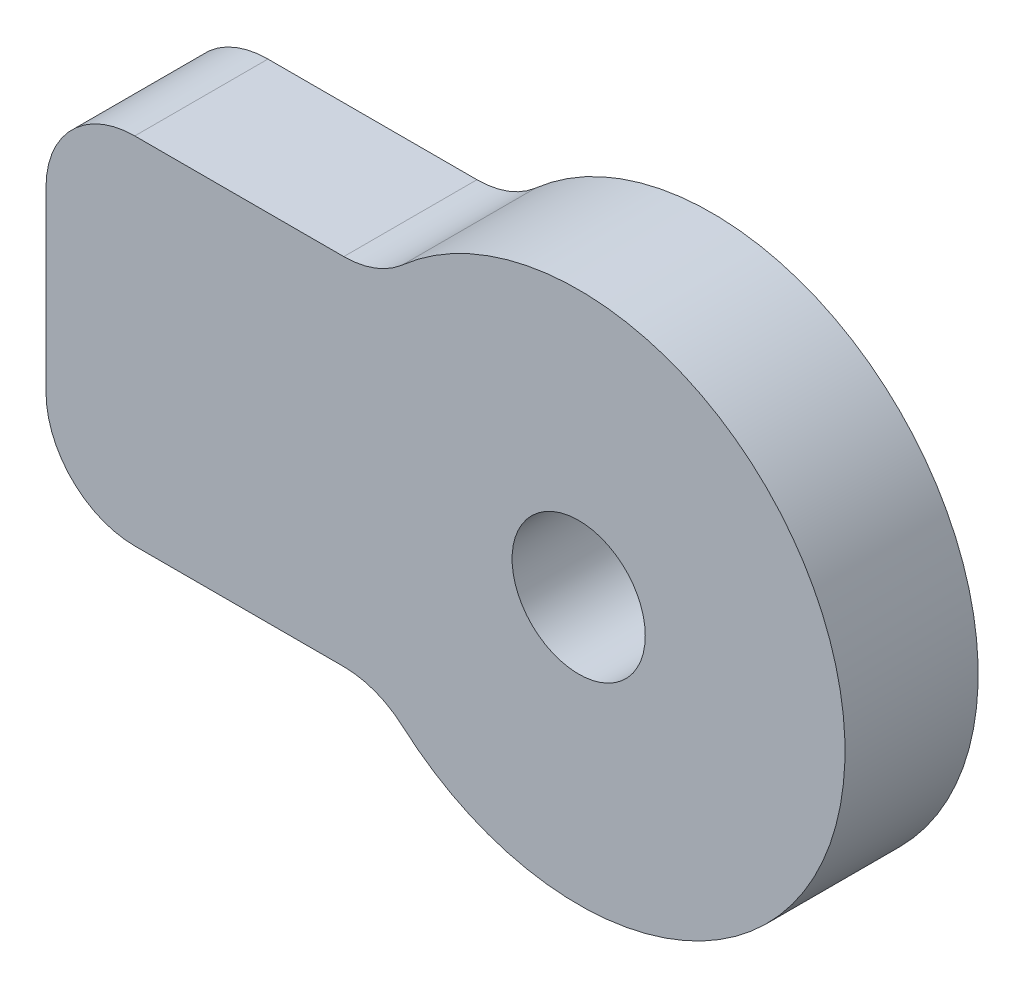
ISO-10303-21;
HEADER;
FILE_DESCRIPTION(('STEP AP214'),'2;1');
FILE_NAME('part.step','',(''),(''),'','','');
FILE_SCHEMA(('AUTOMOTIVE_DESIGN { 1 0 10303 214 1 1 1 1 }'));
ENDSEC;
DATA;
#1=APPLICATION_CONTEXT('core data for automotive mechanical design processes');
#2=APPLICATION_PROTOCOL_DEFINITION('international standard','automotive_design',2000,#1);
#3=PRODUCT_CONTEXT('',#1,'mechanical');
#4=PRODUCT('Part','Part','',(#3));
#5=PRODUCT_RELATED_PRODUCT_CATEGORY('part','',(#4));
#6=PRODUCT_DEFINITION_FORMATION('','',#4);
#7=PRODUCT_DEFINITION_CONTEXT('part definition',#1,'design');
#8=PRODUCT_DEFINITION('design','',#6,#7);
#9=PRODUCT_DEFINITION_SHAPE('','',#8);
#10=(LENGTH_UNIT() NAMED_UNIT(*) SI_UNIT(.MILLI.,.METRE.));
#11=(NAMED_UNIT(*) PLANE_ANGLE_UNIT() SI_UNIT($,.RADIAN.));
#12=(NAMED_UNIT(*) SI_UNIT($,.STERADIAN.) SOLID_ANGLE_UNIT());
#13=UNCERTAINTY_MEASURE_WITH_UNIT(LENGTH_MEASURE(1.E-05),#10,'distance_accuracy_value','');
#14=(GEOMETRIC_REPRESENTATION_CONTEXT(3) GLOBAL_UNCERTAINTY_ASSIGNED_CONTEXT((#13)) GLOBAL_UNIT_ASSIGNED_CONTEXT((#10,
#11,#12)) REPRESENTATION_CONTEXT('',''));
#15=CARTESIAN_POINT('',(0.,0.,0.));
#16=DIRECTION('',(0.,0.,1.));
#17=DIRECTION('',(1.,0.,0.));
#18=AXIS2_PLACEMENT_3D('',#15,#16,#17);
#19=CARTESIAN_POINT('',(0.,0.,3.));
#20=DIRECTION('',(0.,0.,1.));
#21=DIRECTION('',(1.,0.,0.));
#22=AXIS2_PLACEMENT_3D('',#19,#20,#21);
#23=PLANE('',#22);
#24=DIRECTION('',(0.,-1.,0.));
#25=VECTOR('',#24,1.);
#26=CARTESIAN_POINT('',(-12.,4.,3.));
#27=LINE('',#26,#25);
#28=CARTESIAN_POINT('',(-12.,2.,3.));
#29=VERTEX_POINT('',#28);
#30=CARTESIAN_POINT('',(-12.,-2.,3.));
#31=VERTEX_POINT('',#30);
#32=EDGE_CURVE('E166',#29,#31,#27,.T.);
#33=ORIENTED_EDGE('',*,*,#32,.T.);
#34=CARTESIAN_POINT('',(-10.,-2.,3.));
#35=DIRECTION('',(0.,0.,1.));
#36=DIRECTION('',(1.,0.,0.));
#37=AXIS2_PLACEMENT_3D('',#34,#35,#36);
#38=CIRCLE('',#37,2.);
#39=CARTESIAN_POINT('',(-9.99999999999934,-4.,3.));
#40=VERTEX_POINT('',#39);
#41=EDGE_CURVE('E153',#31,#40,#38,.T.);
#42=ORIENTED_EDGE('',*,*,#41,.T.);
#43=DIRECTION('',(1.,0.,0.));
#44=VECTOR('',#43,1.);
#45=CARTESIAN_POINT('',(-4.47213595499907,-4.,3.));
#46=LINE('',#45,#44);
#47=CARTESIAN_POINT('',(-5.29150262212852,-4.,3.));
#48=VERTEX_POINT('',#47);
#49=EDGE_CURVE('E131',#40,#48,#46,.T.);
#50=ORIENTED_EDGE('',*,*,#49,.T.);
#51=CARTESIAN_POINT('',(-5.29150262212852,-6.,3.));
#52=DIRECTION('',(0.,0.,1.));
#53=DIRECTION('',(1.,0.,0.));
#54=AXIS2_PLACEMENT_3D('',#51,#52,#53);
#55=CIRCLE('',#54,2.);
#56=CARTESIAN_POINT('',(-3.96862696659639,-4.5,3.));
#57=VERTEX_POINT('',#56);
#58=EDGE_CURVE('E107',#48,#57,#55,.F.);
#59=ORIENTED_EDGE('',*,*,#58,.T.);
#60=CARTESIAN_POINT('',(0.,0.,3.));
#61=DIRECTION('',(0.,0.,1.));
#62=DIRECTION('',(1.,0.,0.));
#63=AXIS2_PLACEMENT_3D('',#60,#61,#62);
#64=CIRCLE('',#63,6.);
#65=CARTESIAN_POINT('',(-3.96862696659683,4.5,3.));
#66=VERTEX_POINT('',#65);
#67=EDGE_CURVE('E115',#57,#66,#64,.T.);
#68=ORIENTED_EDGE('',*,*,#67,.T.);
#69=CARTESIAN_POINT('',(-5.29150262212918,6.,3.));
#70=DIRECTION('',(0.,0.,1.));
#71=DIRECTION('',(1.,0.,0.));
#72=AXIS2_PLACEMENT_3D('',#69,#70,#71);
#73=CIRCLE('',#72,2.);
#74=CARTESIAN_POINT('',(-5.29150262212918,4.,3.));
#75=VERTEX_POINT('',#74);
#76=EDGE_CURVE('E11',#66,#75,#73,.F.);
#77=ORIENTED_EDGE('',*,*,#76,.T.);
#78=DIRECTION('',(-1.,0.,0.));
#79=VECTOR('',#78,1.);
#80=CARTESIAN_POINT('',(-4.47213595499951,4.,3.));
#81=LINE('',#80,#79);
#82=CARTESIAN_POINT('',(-10.,4.,3.));
#83=VERTEX_POINT('',#82);
#84=EDGE_CURVE('E167',#75,#83,#81,.T.);
#85=ORIENTED_EDGE('',*,*,#84,.T.);
#86=CARTESIAN_POINT('',(-10.,2.,3.));
#87=DIRECTION('',(0.,0.,1.));
#88=DIRECTION('',(1.,0.,0.));
#89=AXIS2_PLACEMENT_3D('',#86,#87,#88);
#90=CIRCLE('',#89,2.);
#91=EDGE_CURVE('E151',#83,#29,#90,.T.);
#92=ORIENTED_EDGE('',*,*,#91,.T.);
#93=EDGE_LOOP('',(#33,#42,#50,#59,#68,#77,#85,#92));
#94=FACE_BOUND('',#93,.T.);
#95=CARTESIAN_POINT('',(0.,0.,3.));
#96=DIRECTION('',(0.,0.,1.));
#97=DIRECTION('',(1.,0.,0.));
#98=AXIS2_PLACEMENT_3D('',#95,#96,#97);
#99=CIRCLE('',#98,1.5);
#100=CARTESIAN_POINT('',(1.5,0.,3.));
#101=VERTEX_POINT('',#100);
#102=EDGE_CURVE('E123',#101,#101,#99,.T.);
#103=ORIENTED_EDGE('',*,*,#102,.F.);
#104=EDGE_LOOP('',(#103));
#105=FACE_BOUND('',#104,.T.);
#106=ADVANCED_FACE('F32',(#94,#105),#23,.T.);
#107=CARTESIAN_POINT('',(0.,0.,0.));
#108=DIRECTION('',(0.,0.,1.));
#109=DIRECTION('',(1.,0.,0.));
#110=AXIS2_PLACEMENT_3D('',#107,#108,#109);
#111=PLANE('',#110);
#112=DIRECTION('',(1.,0.,0.));
#113=VECTOR('',#112,1.);
#114=CARTESIAN_POINT('',(-4.47213595499907,-4.,0.));
#115=LINE('',#114,#113);
#116=CARTESIAN_POINT('',(-9.99999999999934,-4.,0.));
#117=VERTEX_POINT('',#116);
#118=CARTESIAN_POINT('',(-5.29150262212852,-4.,0.));
#119=VERTEX_POINT('',#118);
#120=EDGE_CURVE('E136',#117,#119,#115,.T.);
#121=ORIENTED_EDGE('',*,*,#120,.F.);
#122=CARTESIAN_POINT('',(-10.,-2.,0.));
#123=DIRECTION('',(0.,0.,1.));
#124=DIRECTION('',(1.,0.,0.));
#125=AXIS2_PLACEMENT_3D('',#122,#123,#124);
#126=CIRCLE('',#125,2.);
#127=CARTESIAN_POINT('',(-12.,-2.,0.));
#128=VERTEX_POINT('',#127);
#129=EDGE_CURVE('E144',#117,#128,#126,.F.);
#130=ORIENTED_EDGE('',*,*,#129,.T.);
#131=DIRECTION('',(0.,-1.,0.));
#132=VECTOR('',#131,1.);
#133=CARTESIAN_POINT('',(-12.,4.,0.));
#134=LINE('',#133,#132);
#135=CARTESIAN_POINT('',(-12.,2.,0.));
#136=VERTEX_POINT('',#135);
#137=EDGE_CURVE('E125',#136,#128,#134,.T.);
#138=ORIENTED_EDGE('',*,*,#137,.F.);
#139=CARTESIAN_POINT('',(-10.,2.,0.));
#140=DIRECTION('',(0.,0.,1.));
#141=DIRECTION('',(1.,0.,0.));
#142=AXIS2_PLACEMENT_3D('',#139,#140,#141);
#143=CIRCLE('',#142,2.);
#144=CARTESIAN_POINT('',(-10.,4.,0.));
#145=VERTEX_POINT('',#144);
#146=EDGE_CURVE('E142',#136,#145,#143,.F.);
#147=ORIENTED_EDGE('',*,*,#146,.T.);
#148=DIRECTION('',(-1.,0.,0.));
#149=VECTOR('',#148,1.);
#150=CARTESIAN_POINT('',(-4.47213595499951,4.,0.));
#151=LINE('',#150,#149);
#152=CARTESIAN_POINT('',(-5.29150262212918,4.,0.));
#153=VERTEX_POINT('',#152);
#154=EDGE_CURVE('E122',#153,#145,#151,.T.);
#155=ORIENTED_EDGE('',*,*,#154,.F.);
#156=CARTESIAN_POINT('',(-5.29150262212918,6.,0.));
#157=DIRECTION('',(0.,0.,1.));
#158=DIRECTION('',(1.,0.,0.));
#159=AXIS2_PLACEMENT_3D('',#156,#157,#158);
#160=CIRCLE('',#159,2.);
#161=CARTESIAN_POINT('',(-3.96862696659683,4.5,0.));
#162=VERTEX_POINT('',#161);
#163=EDGE_CURVE('E40',#153,#162,#160,.T.);
#164=ORIENTED_EDGE('',*,*,#163,.T.);
#165=CARTESIAN_POINT('',(0.,0.,0.));
#166=DIRECTION('',(0.,0.,1.));
#167=DIRECTION('',(1.,0.,0.));
#168=AXIS2_PLACEMENT_3D('',#165,#166,#167);
#169=CIRCLE('',#168,6.);
#170=CARTESIAN_POINT('',(-3.96862696659639,-4.5,0.));
#171=VERTEX_POINT('',#170);
#172=EDGE_CURVE('E113',#171,#162,#169,.T.);
#173=ORIENTED_EDGE('',*,*,#172,.F.);
#174=CARTESIAN_POINT('',(-5.29150262212852,-6.,0.));
#175=DIRECTION('',(0.,0.,1.));
#176=DIRECTION('',(1.,0.,0.));
#177=AXIS2_PLACEMENT_3D('',#174,#175,#176);
#178=CIRCLE('',#177,2.);
#179=EDGE_CURVE('E97',#171,#119,#178,.T.);
#180=ORIENTED_EDGE('',*,*,#179,.T.);
#181=EDGE_LOOP('',(#121,#130,#138,#147,#155,#164,#173,#180));
#182=FACE_BOUND('',#181,.T.);
#183=CARTESIAN_POINT('',(0.,0.,0.));
#184=DIRECTION('',(0.,0.,1.));
#185=DIRECTION('',(1.,0.,0.));
#186=AXIS2_PLACEMENT_3D('',#183,#184,#185);
#187=CIRCLE('',#186,1.5);
#188=CARTESIAN_POINT('',(1.5,0.,0.));
#189=VERTEX_POINT('',#188);
#190=EDGE_CURVE('E128',#189,#189,#187,.T.);
#191=ORIENTED_EDGE('',*,*,#190,.T.);
#192=EDGE_LOOP('',(#191));
#193=FACE_BOUND('',#192,.T.);
#194=ADVANCED_FACE('F119',(#182,#193),#111,.F.);
#195=CARTESIAN_POINT('',(0.,0.,3.));
#196=DIRECTION('',(0.,0.,-1.));
#197=DIRECTION('',(-1.,0.,0.));
#198=AXIS2_PLACEMENT_3D('',#195,#196,#197);
#199=CYLINDRICAL_SURFACE('',#198,6.);
#200=ORIENTED_EDGE('',*,*,#67,.F.);
#201=DIRECTION('',(0.,0.,-1.));
#202=VECTOR('',#201,1.);
#203=CARTESIAN_POINT('',(-3.96862696659639,-4.5,3.));
#204=LINE('',#203,#202);
#205=EDGE_CURVE('E101',#57,#171,#204,.T.);
#206=ORIENTED_EDGE('',*,*,#205,.T.);
#207=ORIENTED_EDGE('',*,*,#172,.T.);
#208=DIRECTION('',(0.,0.,-1.));
#209=VECTOR('',#208,1.);
#210=CARTESIAN_POINT('',(-3.96862696659683,4.5,3.));
#211=LINE('',#210,#209);
#212=EDGE_CURVE('E117',#162,#66,#211,.F.);
#213=ORIENTED_EDGE('',*,*,#212,.T.);
#214=EDGE_LOOP('',(#200,#206,#207,#213));
#215=FACE_BOUND('',#214,.T.);
#216=ADVANCED_FACE('F112',(#215),#199,.T.);
#217=CARTESIAN_POINT('',(-4.47213595499951,4.,3.));
#218=DIRECTION('',(0.,-1.,0.));
#219=DIRECTION('',(1.,0.,0.));
#220=AXIS2_PLACEMENT_3D('',#217,#218,#219);
#221=PLANE('',#220);
#222=ORIENTED_EDGE('',*,*,#154,.T.);
#223=DIRECTION('',(0.,0.,-1.));
#224=VECTOR('',#223,1.);
#225=CARTESIAN_POINT('',(-10.,4.,3.));
#226=LINE('',#225,#224);
#227=EDGE_CURVE('E47',#145,#83,#226,.F.);
#228=ORIENTED_EDGE('',*,*,#227,.T.);
#229=ORIENTED_EDGE('',*,*,#84,.F.);
#230=DIRECTION('',(0.,0.,1.));
#231=VECTOR('',#230,1.);
#232=CARTESIAN_POINT('',(-5.29150262212918,4.,0.));
#233=LINE('',#232,#231);
#234=EDGE_CURVE('E155',#75,#153,#233,.F.);
#235=ORIENTED_EDGE('',*,*,#234,.T.);
#236=EDGE_LOOP('',(#222,#228,#229,#235));
#237=FACE_BOUND('',#236,.T.);
#238=ADVANCED_FACE('F197',(#237),#221,.F.);
#239=CARTESIAN_POINT('',(-12.,4.,3.));
#240=DIRECTION('',(1.,0.,0.));
#241=DIRECTION('',(0.,0.,-1.));
#242=AXIS2_PLACEMENT_3D('',#239,#240,#241);
#243=PLANE('',#242);
#244=ORIENTED_EDGE('',*,*,#137,.T.);
#245=DIRECTION('',(0.,0.,-1.));
#246=VECTOR('',#245,1.);
#247=CARTESIAN_POINT('',(-12.,-2.,3.));
#248=LINE('',#247,#246);
#249=EDGE_CURVE('E149',#128,#31,#248,.F.);
#250=ORIENTED_EDGE('',*,*,#249,.T.);
#251=ORIENTED_EDGE('',*,*,#32,.F.);
#252=DIRECTION('',(0.,0.,-1.));
#253=VECTOR('',#252,1.);
#254=CARTESIAN_POINT('',(-12.,2.,3.));
#255=LINE('',#254,#253);
#256=EDGE_CURVE('E146',#29,#136,#255,.T.);
#257=ORIENTED_EDGE('',*,*,#256,.T.);
#258=EDGE_LOOP('',(#244,#250,#251,#257));
#259=FACE_BOUND('',#258,.T.);
#260=ADVANCED_FACE('F186',(#259),#243,.F.);
#261=CARTESIAN_POINT('',(-4.47213595499907,-4.,3.));
#262=DIRECTION('',(0.,1.,0.));
#263=DIRECTION('',(-1.,0.,0.));
#264=AXIS2_PLACEMENT_3D('',#261,#262,#263);
#265=PLANE('',#264);
#266=ORIENTED_EDGE('',*,*,#120,.T.);
#267=DIRECTION('',(0.,0.,1.));
#268=VECTOR('',#267,1.);
#269=CARTESIAN_POINT('',(-5.29150262212852,-4.,3.));
#270=LINE('',#269,#268);
#271=EDGE_CURVE('E102',#119,#48,#270,.T.);
#272=ORIENTED_EDGE('',*,*,#271,.T.);
#273=ORIENTED_EDGE('',*,*,#49,.F.);
#274=DIRECTION('',(0.,0.,-1.));
#275=VECTOR('',#274,1.);
#276=CARTESIAN_POINT('',(-9.99999999999934,-4.,3.));
#277=LINE('',#276,#275);
#278=EDGE_CURVE('E116',#40,#117,#277,.T.);
#279=ORIENTED_EDGE('',*,*,#278,.T.);
#280=EDGE_LOOP('',(#266,#272,#273,#279));
#281=FACE_BOUND('',#280,.T.);
#282=ADVANCED_FACE('F177',(#281),#265,.F.);
#283=CARTESIAN_POINT('',(0.,0.,3.));
#284=DIRECTION('',(0.,0.,-1.));
#285=DIRECTION('',(-1.,0.,0.));
#286=AXIS2_PLACEMENT_3D('',#283,#284,#285);
#287=CYLINDRICAL_SURFACE('',#286,1.5);
#288=ORIENTED_EDGE('',*,*,#102,.T.);
#289=EDGE_LOOP('',(#288));
#290=FACE_BOUND('',#289,.T.);
#291=ORIENTED_EDGE('',*,*,#190,.F.);
#292=EDGE_LOOP('',(#291));
#293=FACE_BOUND('',#292,.T.);
#294=ADVANCED_FACE('F175',(#290,#293),#287,.F.);
#295=CARTESIAN_POINT('',(-5.29150262212852,-6.,3.));
#296=DIRECTION('',(0.,0.,-1.));
#297=DIRECTION('',(-1.,0.,0.));
#298=AXIS2_PLACEMENT_3D('',#295,#296,#297);
#299=CYLINDRICAL_SURFACE('',#298,2.);
#300=ORIENTED_EDGE('',*,*,#58,.F.);
#301=ORIENTED_EDGE('',*,*,#271,.F.);
#302=ORIENTED_EDGE('',*,*,#179,.F.);
#303=ORIENTED_EDGE('',*,*,#205,.F.);
#304=EDGE_LOOP('',(#300,#301,#302,#303));
#305=FACE_BOUND('',#304,.T.);
#306=ADVANCED_FACE('F100',(#305),#299,.F.);
#307=CARTESIAN_POINT('',(-10.,-2.,3.));
#308=DIRECTION('',(0.,0.,-1.));
#309=DIRECTION('',(-1.,0.,0.));
#310=AXIS2_PLACEMENT_3D('',#307,#308,#309);
#311=CYLINDRICAL_SURFACE('',#310,2.);
#312=ORIENTED_EDGE('',*,*,#41,.F.);
#313=ORIENTED_EDGE('',*,*,#249,.F.);
#314=ORIENTED_EDGE('',*,*,#129,.F.);
#315=ORIENTED_EDGE('',*,*,#278,.F.);
#316=EDGE_LOOP('',(#312,#313,#314,#315));
#317=FACE_BOUND('',#316,.T.);
#318=ADVANCED_FACE('F184',(#317),#311,.T.);
#319=CARTESIAN_POINT('',(-10.,2.,3.));
#320=DIRECTION('',(0.,0.,-1.));
#321=DIRECTION('',(-1.,0.,0.));
#322=AXIS2_PLACEMENT_3D('',#319,#320,#321);
#323=CYLINDRICAL_SURFACE('',#322,2.);
#324=ORIENTED_EDGE('',*,*,#91,.F.);
#325=ORIENTED_EDGE('',*,*,#227,.F.);
#326=ORIENTED_EDGE('',*,*,#146,.F.);
#327=ORIENTED_EDGE('',*,*,#256,.F.);
#328=EDGE_LOOP('',(#324,#325,#326,#327));
#329=FACE_BOUND('',#328,.T.);
#330=ADVANCED_FACE('F204',(#329),#323,.T.);
#331=CARTESIAN_POINT('',(-5.29150262212918,6.,3.));
#332=DIRECTION('',(0.,0.,-1.));
#333=DIRECTION('',(-1.,0.,0.));
#334=AXIS2_PLACEMENT_3D('',#331,#332,#333);
#335=CYLINDRICAL_SURFACE('',#334,2.);
#336=ORIENTED_EDGE('',*,*,#76,.F.);
#337=ORIENTED_EDGE('',*,*,#212,.F.);
#338=ORIENTED_EDGE('',*,*,#163,.F.);
#339=ORIENTED_EDGE('',*,*,#234,.F.);
#340=EDGE_LOOP('',(#336,#337,#338,#339));
#341=FACE_BOUND('',#340,.T.);
#342=ADVANCED_FACE('F34',(#341),#335,.F.);
#343=CLOSED_SHELL('',(#106,#194,#216,#238,#260,#282,#294,#306,#318,#330,#342));
#344=MANIFOLD_SOLID_BREP('B2',#343);
#345=ADVANCED_BREP_SHAPE_REPRESENTATION('',(#18,#344),#14);
#346=SHAPE_DEFINITION_REPRESENTATION(#9,#345);
ENDSEC;
END-ISO-10303-21;
